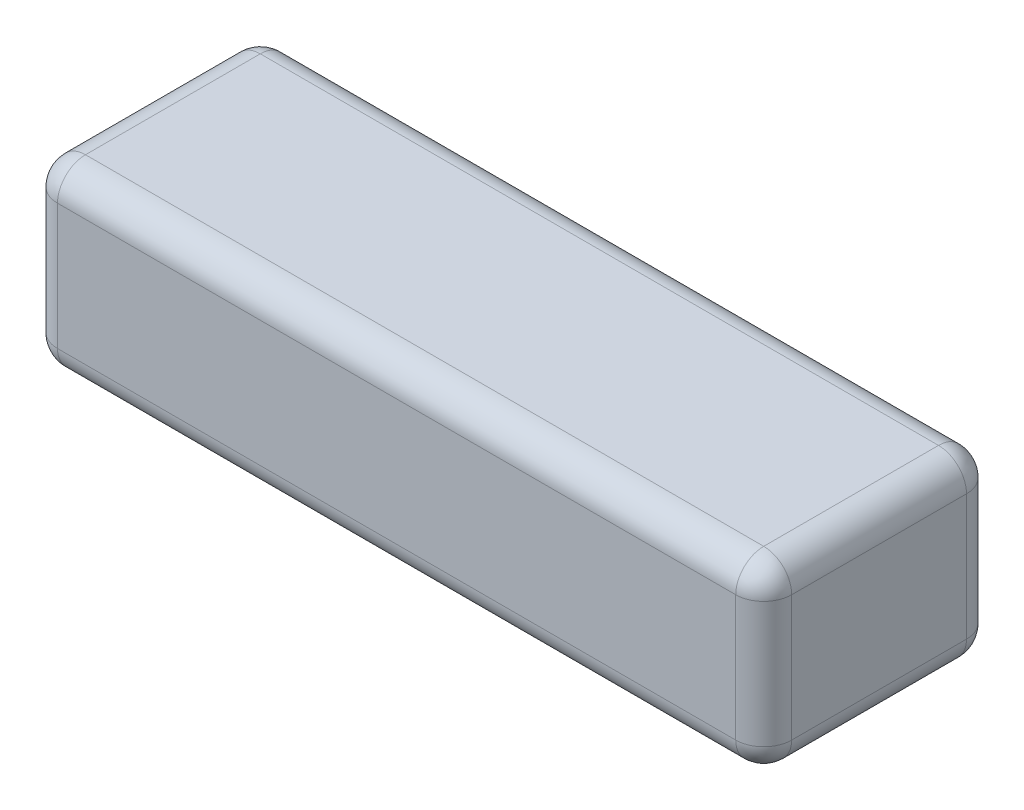
ISO-10303-21;
HEADER;
FILE_DESCRIPTION(('STEP AP214'),'2;1');
FILE_NAME('part.step','',(''),(''),'','','');
FILE_SCHEMA(('AUTOMOTIVE_DESIGN { 1 0 10303 214 1 1 1 1 }'));
ENDSEC;
DATA;
#1=APPLICATION_CONTEXT('core data for automotive mechanical design processes');
#2=APPLICATION_PROTOCOL_DEFINITION('international standard','automotive_design',2000,#1);
#3=PRODUCT_CONTEXT('',#1,'mechanical');
#4=PRODUCT('Part','Part','',(#3));
#5=PRODUCT_RELATED_PRODUCT_CATEGORY('part','',(#4));
#6=PRODUCT_DEFINITION_FORMATION('','',#4);
#7=PRODUCT_DEFINITION_CONTEXT('part definition',#1,'design');
#8=PRODUCT_DEFINITION('design','',#6,#7);
#9=PRODUCT_DEFINITION_SHAPE('','',#8);
#10=(LENGTH_UNIT() NAMED_UNIT(*) SI_UNIT(.MILLI.,.METRE.));
#11=(NAMED_UNIT(*) PLANE_ANGLE_UNIT() SI_UNIT($,.RADIAN.));
#12=(NAMED_UNIT(*) SI_UNIT($,.STERADIAN.) SOLID_ANGLE_UNIT());
#13=UNCERTAINTY_MEASURE_WITH_UNIT(LENGTH_MEASURE(1.E-05),#10,'distance_accuracy_value','');
#14=(GEOMETRIC_REPRESENTATION_CONTEXT(3) GLOBAL_UNCERTAINTY_ASSIGNED_CONTEXT((#13)) GLOBAL_UNIT_ASSIGNED_CONTEXT((#10,
#11,#12)) REPRESENTATION_CONTEXT('',''));
#15=CARTESIAN_POINT('',(0.,0.,0.));
#16=DIRECTION('',(0.,0.,1.));
#17=DIRECTION('',(1.,0.,0.));
#18=AXIS2_PLACEMENT_3D('',#15,#16,#17);
#19=CARTESIAN_POINT('',(0.,26.,0.));
#20=DIRECTION('',(1.,0.,0.));
#21=DIRECTION('',(0.,0.,-1.));
#22=AXIS2_PLACEMENT_3D('',#19,#20,#21);
#23=PLANE('',#22);
#24=DIRECTION('',(0.,0.,1.));
#25=VECTOR('',#24,1.);
#26=CARTESIAN_POINT('',(0.,4.,0.));
#27=LINE('',#26,#25);
#28=CARTESIAN_POINT('',(0.,4.,-29.));
#29=VERTEX_POINT('',#28);
#30=CARTESIAN_POINT('',(0.,4.,-4.));
#31=VERTEX_POINT('',#30);
#32=EDGE_CURVE('E166',#29,#31,#27,.T.);
#33=ORIENTED_EDGE('',*,*,#32,.T.);
#34=DIRECTION('',(0.,-1.,0.));
#35=VECTOR('',#34,1.);
#36=CARTESIAN_POINT('',(0.,26.,-4.));
#37=LINE('',#36,#35);
#38=CARTESIAN_POINT('',(0.,22.,-4.));
#39=VERTEX_POINT('',#38);
#40=EDGE_CURVE('E168',#31,#39,#37,.F.);
#41=ORIENTED_EDGE('',*,*,#40,.T.);
#42=DIRECTION('',(0.,0.,1.));
#43=VECTOR('',#42,1.);
#44=CARTESIAN_POINT('',(0.,22.,0.));
#45=LINE('',#44,#43);
#46=CARTESIAN_POINT('',(0.,22.,-29.));
#47=VERTEX_POINT('',#46);
#48=EDGE_CURVE('E164',#39,#47,#45,.F.);
#49=ORIENTED_EDGE('',*,*,#48,.T.);
#50=DIRECTION('',(0.,-1.,0.));
#51=VECTOR('',#50,1.);
#52=CARTESIAN_POINT('',(0.,26.,-29.));
#53=LINE('',#52,#51);
#54=EDGE_CURVE('E162',#47,#29,#53,.T.);
#55=ORIENTED_EDGE('',*,*,#54,.T.);
#56=EDGE_LOOP('',(#33,#41,#49,#55));
#57=FACE_BOUND('',#56,.T.);
#58=ADVANCED_FACE('F34',(#57),#23,.F.);
#59=CARTESIAN_POINT('',(0.,26.,0.));
#60=DIRECTION('',(0.,0.,-1.));
#61=DIRECTION('',(-1.,0.,0.));
#62=AXIS2_PLACEMENT_3D('',#59,#60,#61);
#63=PLANE('',#62);
#64=DIRECTION('',(0.,-1.,0.));
#65=VECTOR('',#64,1.);
#66=CARTESIAN_POINT('',(4.,26.,0.));
#67=LINE('',#66,#65);
#68=CARTESIAN_POINT('',(4.,22.,0.));
#69=VERTEX_POINT('',#68);
#70=CARTESIAN_POINT('',(4.,4.,0.));
#71=VERTEX_POINT('',#70);
#72=EDGE_CURVE('E133',#69,#71,#67,.T.);
#73=ORIENTED_EDGE('',*,*,#72,.T.);
#74=DIRECTION('',(1.,0.,0.));
#75=VECTOR('',#74,1.);
#76=CARTESIAN_POINT('',(105.,4.,0.));
#77=LINE('',#76,#75);
#78=CARTESIAN_POINT('',(101.,4.,0.));
#79=VERTEX_POINT('',#78);
#80=EDGE_CURVE('E129',#71,#79,#77,.T.);
#81=ORIENTED_EDGE('',*,*,#80,.T.);
#82=DIRECTION('',(0.,-1.,0.));
#83=VECTOR('',#82,1.);
#84=CARTESIAN_POINT('',(101.,26.,0.));
#85=LINE('',#84,#83);
#86=CARTESIAN_POINT('',(101.,22.,0.));
#87=VERTEX_POINT('',#86);
#88=EDGE_CURVE('E121',#79,#87,#85,.F.);
#89=ORIENTED_EDGE('',*,*,#88,.T.);
#90=DIRECTION('',(1.,0.,0.));
#91=VECTOR('',#90,1.);
#92=CARTESIAN_POINT('',(0.,22.,0.));
#93=LINE('',#92,#91);
#94=EDGE_CURVE('E126',#87,#69,#93,.F.);
#95=ORIENTED_EDGE('',*,*,#94,.T.);
#96=EDGE_LOOP('',(#73,#81,#89,#95));
#97=FACE_BOUND('',#96,.T.);
#98=ADVANCED_FACE('F124',(#97),#63,.F.);
#99=CARTESIAN_POINT('',(105.,26.,0.));
#100=DIRECTION('',(-1.,0.,0.));
#101=DIRECTION('',(0.,0.,1.));
#102=AXIS2_PLACEMENT_3D('',#99,#100,#101);
#103=PLANE('',#102);
#104=DIRECTION('',(0.,-1.,0.));
#105=VECTOR('',#104,1.);
#106=CARTESIAN_POINT('',(105.,26.,-4.));
#107=LINE('',#106,#105);
#108=CARTESIAN_POINT('',(105.,22.,-4.));
#109=VERTEX_POINT('',#108);
#110=CARTESIAN_POINT('',(105.,4.,-4.));
#111=VERTEX_POINT('',#110);
#112=EDGE_CURVE('E54',#109,#111,#107,.T.);
#113=ORIENTED_EDGE('',*,*,#112,.T.);
#114=DIRECTION('',(0.,0.,-1.));
#115=VECTOR('',#114,1.);
#116=CARTESIAN_POINT('',(105.,4.,-33.));
#117=LINE('',#116,#115);
#118=CARTESIAN_POINT('',(105.,4.,-29.));
#119=VERTEX_POINT('',#118);
#120=EDGE_CURVE('E11',#111,#119,#117,.T.);
#121=ORIENTED_EDGE('',*,*,#120,.T.);
#122=DIRECTION('',(0.,-1.,0.));
#123=VECTOR('',#122,1.);
#124=CARTESIAN_POINT('',(105.,26.,-29.));
#125=LINE('',#124,#123);
#126=CARTESIAN_POINT('',(105.,22.,-29.));
#127=VERTEX_POINT('',#126);
#128=EDGE_CURVE('E43',#119,#127,#125,.F.);
#129=ORIENTED_EDGE('',*,*,#128,.T.);
#130=DIRECTION('',(0.,0.,-1.));
#131=VECTOR('',#130,1.);
#132=CARTESIAN_POINT('',(105.,22.,0.));
#133=LINE('',#132,#131);
#134=EDGE_CURVE('E198',#127,#109,#133,.F.);
#135=ORIENTED_EDGE('',*,*,#134,.T.);
#136=EDGE_LOOP('',(#113,#121,#129,#135));
#137=FACE_BOUND('',#136,.T.);
#138=ADVANCED_FACE('F295',(#137),#103,.F.);
#139=CARTESIAN_POINT('',(0.,26.,-33.));
#140=DIRECTION('',(0.,0.,1.));
#141=DIRECTION('',(1.,0.,0.));
#142=AXIS2_PLACEMENT_3D('',#139,#140,#141);
#143=PLANE('',#142);
#144=DIRECTION('',(0.,-1.,0.));
#145=VECTOR('',#144,1.);
#146=CARTESIAN_POINT('',(101.,26.,-33.));
#147=LINE('',#146,#145);
#148=CARTESIAN_POINT('',(101.,22.,-33.));
#149=VERTEX_POINT('',#148);
#150=CARTESIAN_POINT('',(101.,4.,-33.));
#151=VERTEX_POINT('',#150);
#152=EDGE_CURVE('E191',#149,#151,#147,.T.);
#153=ORIENTED_EDGE('',*,*,#152,.T.);
#154=DIRECTION('',(-1.,0.,0.));
#155=VECTOR('',#154,1.);
#156=CARTESIAN_POINT('',(0.,4.,-33.));
#157=LINE('',#156,#155);
#158=CARTESIAN_POINT('',(4.,4.,-33.));
#159=VERTEX_POINT('',#158);
#160=EDGE_CURVE('E196',#151,#159,#157,.T.);
#161=ORIENTED_EDGE('',*,*,#160,.T.);
#162=DIRECTION('',(0.,-1.,0.));
#163=VECTOR('',#162,1.);
#164=CARTESIAN_POINT('',(4.,26.,-33.));
#165=LINE('',#164,#163);
#166=CARTESIAN_POINT('',(4.,22.,-33.));
#167=VERTEX_POINT('',#166);
#168=EDGE_CURVE('E193',#159,#167,#165,.F.);
#169=ORIENTED_EDGE('',*,*,#168,.T.);
#170=DIRECTION('',(-1.,0.,0.));
#171=VECTOR('',#170,1.);
#172=CARTESIAN_POINT('',(0.,22.,-33.));
#173=LINE('',#172,#171);
#174=EDGE_CURVE('E189',#167,#149,#173,.F.);
#175=ORIENTED_EDGE('',*,*,#174,.T.);
#176=EDGE_LOOP('',(#153,#161,#169,#175));
#177=FACE_BOUND('',#176,.T.);
#178=ADVANCED_FACE('F273',(#177),#143,.F.);
#179=CARTESIAN_POINT('',(0.,26.,0.));
#180=DIRECTION('',(0.,-1.,0.));
#181=DIRECTION('',(0.,0.,-1.));
#182=AXIS2_PLACEMENT_3D('',#179,#180,#181);
#183=PLANE('',#182);
#184=DIRECTION('',(0.,0.,-1.));
#185=VECTOR('',#184,1.);
#186=CARTESIAN_POINT('',(101.,26.,0.));
#187=LINE('',#186,#185);
#188=CARTESIAN_POINT('',(101.,26.,-4.));
#189=VERTEX_POINT('',#188);
#190=CARTESIAN_POINT('',(101.,26.,-29.));
#191=VERTEX_POINT('',#190);
#192=EDGE_CURVE('E182',#189,#191,#187,.T.);
#193=ORIENTED_EDGE('',*,*,#192,.T.);
#194=DIRECTION('',(-1.,0.,0.));
#195=VECTOR('',#194,1.);
#196=CARTESIAN_POINT('',(0.,26.,-29.));
#197=LINE('',#196,#195);
#198=CARTESIAN_POINT('',(4.,26.,-29.));
#199=VERTEX_POINT('',#198);
#200=EDGE_CURVE('E187',#191,#199,#197,.T.);
#201=ORIENTED_EDGE('',*,*,#200,.T.);
#202=DIRECTION('',(0.,0.,1.));
#203=VECTOR('',#202,1.);
#204=CARTESIAN_POINT('',(4.,26.,0.));
#205=LINE('',#204,#203);
#206=CARTESIAN_POINT('',(4.,26.,-4.));
#207=VERTEX_POINT('',#206);
#208=EDGE_CURVE('E184',#199,#207,#205,.T.);
#209=ORIENTED_EDGE('',*,*,#208,.T.);
#210=DIRECTION('',(1.,0.,0.));
#211=VECTOR('',#210,1.);
#212=CARTESIAN_POINT('',(0.,26.,-4.));
#213=LINE('',#212,#211);
#214=EDGE_CURVE('E180',#207,#189,#213,.T.);
#215=ORIENTED_EDGE('',*,*,#214,.T.);
#216=EDGE_LOOP('',(#193,#201,#209,#215));
#217=FACE_BOUND('',#216,.T.);
#218=ADVANCED_FACE('F302',(#217),#183,.F.);
#219=CARTESIAN_POINT('',(0.,0.,0.));
#220=DIRECTION('',(0.,-1.,0.));
#221=DIRECTION('',(0.,0.,-1.));
#222=AXIS2_PLACEMENT_3D('',#219,#220,#221);
#223=PLANE('',#222);
#224=DIRECTION('',(0.,0.,1.));
#225=VECTOR('',#224,1.);
#226=CARTESIAN_POINT('',(4.,0.,-33.));
#227=LINE('',#226,#225);
#228=CARTESIAN_POINT('',(4.,0.,-4.));
#229=VERTEX_POINT('',#228);
#230=CARTESIAN_POINT('',(4.,0.,-29.));
#231=VERTEX_POINT('',#230);
#232=EDGE_CURVE('E175',#229,#231,#227,.F.);
#233=ORIENTED_EDGE('',*,*,#232,.T.);
#234=DIRECTION('',(-1.,0.,0.));
#235=VECTOR('',#234,1.);
#236=CARTESIAN_POINT('',(105.,0.,-29.));
#237=LINE('',#236,#235);
#238=CARTESIAN_POINT('',(101.,0.,-29.));
#239=VERTEX_POINT('',#238);
#240=EDGE_CURVE('E178',#231,#239,#237,.F.);
#241=ORIENTED_EDGE('',*,*,#240,.T.);
#242=DIRECTION('',(0.,0.,-1.));
#243=VECTOR('',#242,1.);
#244=CARTESIAN_POINT('',(101.,0.,0.));
#245=LINE('',#244,#243);
#246=CARTESIAN_POINT('',(101.,0.,-4.));
#247=VERTEX_POINT('',#246);
#248=EDGE_CURVE('E173',#239,#247,#245,.F.);
#249=ORIENTED_EDGE('',*,*,#248,.T.);
#250=DIRECTION('',(1.,0.,0.));
#251=VECTOR('',#250,1.);
#252=CARTESIAN_POINT('',(0.,0.,-4.));
#253=LINE('',#252,#251);
#254=EDGE_CURVE('E171',#247,#229,#253,.F.);
#255=ORIENTED_EDGE('',*,*,#254,.T.);
#256=EDGE_LOOP('',(#233,#241,#249,#255));
#257=FACE_BOUND('',#256,.T.);
#258=ADVANCED_FACE('F264',(#257),#223,.T.);
#259=CARTESIAN_POINT('',(101.,26.,-29.));
#260=DIRECTION('',(0.,-1.,0.));
#261=DIRECTION('',(0.,0.,-1.));
#262=AXIS2_PLACEMENT_3D('',#259,#260,#261);
#263=CYLINDRICAL_SURFACE('',#262,4.);
#264=CARTESIAN_POINT('',(101.,22.,-29.));
#265=DIRECTION('',(0.,1.,0.));
#266=DIRECTION('',(0.,0.,1.));
#267=AXIS2_PLACEMENT_3D('',#264,#265,#266);
#268=CIRCLE('',#267,4.);
#269=EDGE_CURVE('E38',#127,#149,#268,.T.);
#270=ORIENTED_EDGE('',*,*,#269,.F.);
#271=ORIENTED_EDGE('',*,*,#128,.F.);
#272=CARTESIAN_POINT('',(101.,4.,-29.));
#273=DIRECTION('',(0.,-1.,0.));
#274=DIRECTION('',(0.,0.,-1.));
#275=AXIS2_PLACEMENT_3D('',#272,#273,#274);
#276=CIRCLE('',#275,4.);
#277=EDGE_CURVE('E158',#151,#119,#276,.T.);
#278=ORIENTED_EDGE('',*,*,#277,.F.);
#279=ORIENTED_EDGE('',*,*,#152,.F.);
#280=EDGE_LOOP('',(#270,#271,#278,#279));
#281=FACE_BOUND('',#280,.T.);
#282=ADVANCED_FACE('F36',(#281),#263,.T.);
#283=CARTESIAN_POINT('',(101.,22.,-29.));
#284=DIRECTION('',(0.,0.,1.));
#285=DIRECTION('',(1.,0.,0.));
#286=AXIS2_PLACEMENT_3D('',#283,#284,#285);
#287=SPHERICAL_SURFACE('',#286,4.);
#288=CARTESIAN_POINT('',(101.,22.,-29.));
#289=DIRECTION('',(0.,0.,-1.));
#290=DIRECTION('',(-1.,0.,0.));
#291=AXIS2_PLACEMENT_3D('',#288,#289,#290);
#292=CIRCLE('',#291,4.);
#293=EDGE_CURVE('E244',#127,#191,#292,.F.);
#294=ORIENTED_EDGE('',*,*,#293,.F.);
#295=ORIENTED_EDGE('',*,*,#269,.T.);
#296=CARTESIAN_POINT('',(101.,22.,-29.));
#297=DIRECTION('',(1.,0.,0.));
#298=DIRECTION('',(0.,0.,-1.));
#299=AXIS2_PLACEMENT_3D('',#296,#297,#298);
#300=CIRCLE('',#299,4.);
#301=EDGE_CURVE('E247',#191,#149,#300,.F.);
#302=ORIENTED_EDGE('',*,*,#301,.F.);
#303=EDGE_LOOP('',(#294,#295,#302));
#304=FACE_BOUND('',#303,.T.);
#305=ADVANCED_FACE('F291',(#304),#287,.T.);
#306=CARTESIAN_POINT('',(101.,4.,-29.));
#307=DIRECTION('',(0.,0.,1.));
#308=DIRECTION('',(1.,0.,0.));
#309=AXIS2_PLACEMENT_3D('',#306,#307,#308);
#310=SPHERICAL_SURFACE('',#309,4.);
#311=CARTESIAN_POINT('',(101.,4.,-29.));
#312=DIRECTION('',(1.,0.,0.));
#313=DIRECTION('',(0.,0.,-1.));
#314=AXIS2_PLACEMENT_3D('',#311,#312,#313);
#315=CIRCLE('',#314,4.);
#316=EDGE_CURVE('E238',#151,#239,#315,.F.);
#317=ORIENTED_EDGE('',*,*,#316,.F.);
#318=ORIENTED_EDGE('',*,*,#277,.T.);
#319=CARTESIAN_POINT('',(101.,4.,-29.));
#320=DIRECTION('',(0.,0.,-1.));
#321=DIRECTION('',(-1.,0.,0.));
#322=AXIS2_PLACEMENT_3D('',#319,#320,#321);
#323=CIRCLE('',#322,4.);
#324=EDGE_CURVE('E241',#239,#119,#323,.F.);
#325=ORIENTED_EDGE('',*,*,#324,.F.);
#326=EDGE_LOOP('',(#317,#318,#325));
#327=FACE_BOUND('',#326,.T.);
#328=ADVANCED_FACE('F254',(#327),#310,.T.);
#329=CARTESIAN_POINT('',(0.,22.,-29.));
#330=DIRECTION('',(-1.,0.,0.));
#331=DIRECTION('',(0.,0.,1.));
#332=AXIS2_PLACEMENT_3D('',#329,#330,#331);
#333=CYLINDRICAL_SURFACE('',#332,4.);
#334=ORIENTED_EDGE('',*,*,#301,.T.);
#335=ORIENTED_EDGE('',*,*,#174,.F.);
#336=CARTESIAN_POINT('',(4.,22.,-29.));
#337=DIRECTION('',(-1.,0.,0.));
#338=DIRECTION('',(0.,0.,1.));
#339=AXIS2_PLACEMENT_3D('',#336,#337,#338);
#340=CIRCLE('',#339,4.);
#341=EDGE_CURVE('E233',#199,#167,#340,.T.);
#342=ORIENTED_EDGE('',*,*,#341,.F.);
#343=ORIENTED_EDGE('',*,*,#200,.F.);
#344=EDGE_LOOP('',(#334,#335,#342,#343));
#345=FACE_BOUND('',#344,.T.);
#346=ADVANCED_FACE('F285',(#345),#333,.T.);
#347=CARTESIAN_POINT('',(101.,22.,0.));
#348=DIRECTION('',(0.,0.,-1.));
#349=DIRECTION('',(-1.,0.,0.));
#350=AXIS2_PLACEMENT_3D('',#347,#348,#349);
#351=CYLINDRICAL_SURFACE('',#350,4.);
#352=ORIENTED_EDGE('',*,*,#293,.T.);
#353=ORIENTED_EDGE('',*,*,#192,.F.);
#354=CARTESIAN_POINT('',(101.,22.,-4.));
#355=DIRECTION('',(0.,0.,1.));
#356=DIRECTION('',(0.,-1.,0.));
#357=AXIS2_PLACEMENT_3D('',#354,#355,#356);
#358=CIRCLE('',#357,4.);
#359=EDGE_CURVE('E142',#109,#189,#358,.T.);
#360=ORIENTED_EDGE('',*,*,#359,.F.);
#361=ORIENTED_EDGE('',*,*,#134,.F.);
#362=EDGE_LOOP('',(#352,#353,#360,#361));
#363=FACE_BOUND('',#362,.T.);
#364=ADVANCED_FACE('F294',(#363),#351,.T.);
#365=CARTESIAN_POINT('',(101.,26.,-4.));
#366=DIRECTION('',(0.,-1.,0.));
#367=DIRECTION('',(0.,0.,-1.));
#368=AXIS2_PLACEMENT_3D('',#365,#366,#367);
#369=CYLINDRICAL_SURFACE('',#368,4.);
#370=CARTESIAN_POINT('',(101.,4.,-4.));
#371=DIRECTION('',(0.,-1.,0.));
#372=DIRECTION('',(0.,0.,-1.));
#373=AXIS2_PLACEMENT_3D('',#370,#371,#372);
#374=CIRCLE('',#373,4.);
#375=EDGE_CURVE('E143',#111,#79,#374,.T.);
#376=ORIENTED_EDGE('',*,*,#375,.F.);
#377=ORIENTED_EDGE('',*,*,#112,.F.);
#378=CARTESIAN_POINT('',(101.,22.,-4.));
#379=DIRECTION('',(0.,1.,0.));
#380=DIRECTION('',(0.,0.,1.));
#381=AXIS2_PLACEMENT_3D('',#378,#379,#380);
#382=CIRCLE('',#381,4.);
#383=EDGE_CURVE('E136',#87,#109,#382,.T.);
#384=ORIENTED_EDGE('',*,*,#383,.F.);
#385=ORIENTED_EDGE('',*,*,#88,.F.);
#386=EDGE_LOOP('',(#376,#377,#384,#385));
#387=FACE_BOUND('',#386,.T.);
#388=ADVANCED_FACE('F138',(#387),#369,.T.);
#389=CARTESIAN_POINT('',(101.,4.,0.));
#390=DIRECTION('',(0.,0.,1.));
#391=DIRECTION('',(1.,0.,0.));
#392=AXIS2_PLACEMENT_3D('',#389,#390,#391);
#393=CYLINDRICAL_SURFACE('',#392,4.);
#394=ORIENTED_EDGE('',*,*,#324,.T.);
#395=ORIENTED_EDGE('',*,*,#120,.F.);
#396=CARTESIAN_POINT('',(101.,4.,-4.));
#397=DIRECTION('',(0.,0.,1.));
#398=DIRECTION('',(1.,0.,0.));
#399=AXIS2_PLACEMENT_3D('',#396,#397,#398);
#400=CIRCLE('',#399,4.);
#401=EDGE_CURVE('E228',#247,#111,#400,.T.);
#402=ORIENTED_EDGE('',*,*,#401,.F.);
#403=ORIENTED_EDGE('',*,*,#248,.F.);
#404=EDGE_LOOP('',(#394,#395,#402,#403));
#405=FACE_BOUND('',#404,.T.);
#406=ADVANCED_FACE('F260',(#405),#393,.T.);
#407=CARTESIAN_POINT('',(0.,4.,-29.));
#408=DIRECTION('',(1.,0.,0.));
#409=DIRECTION('',(0.,0.,-1.));
#410=AXIS2_PLACEMENT_3D('',#407,#408,#409);
#411=CYLINDRICAL_SURFACE('',#410,4.);
#412=ORIENTED_EDGE('',*,*,#316,.T.);
#413=ORIENTED_EDGE('',*,*,#240,.F.);
#414=CARTESIAN_POINT('',(4.,4.,-29.));
#415=DIRECTION('',(-1.,0.,0.));
#416=DIRECTION('',(0.,0.,1.));
#417=AXIS2_PLACEMENT_3D('',#414,#415,#416);
#418=CIRCLE('',#417,4.);
#419=EDGE_CURVE('E225',#159,#231,#418,.T.);
#420=ORIENTED_EDGE('',*,*,#419,.F.);
#421=ORIENTED_EDGE('',*,*,#160,.F.);
#422=EDGE_LOOP('',(#412,#413,#420,#421));
#423=FACE_BOUND('',#422,.T.);
#424=ADVANCED_FACE('F270',(#423),#411,.T.);
#425=CARTESIAN_POINT('',(4.,26.,-29.));
#426=DIRECTION('',(0.,-1.,0.));
#427=DIRECTION('',(0.,0.,-1.));
#428=AXIS2_PLACEMENT_3D('',#425,#426,#427);
#429=CYLINDRICAL_SURFACE('',#428,4.);
#430=CARTESIAN_POINT('',(4.,22.,-29.));
#431=DIRECTION('',(0.,1.,0.));
#432=DIRECTION('',(0.,0.,1.));
#433=AXIS2_PLACEMENT_3D('',#430,#431,#432);
#434=CIRCLE('',#433,4.);
#435=EDGE_CURVE('E235',#167,#47,#434,.T.);
#436=ORIENTED_EDGE('',*,*,#435,.F.);
#437=ORIENTED_EDGE('',*,*,#168,.F.);
#438=CARTESIAN_POINT('',(4.,4.,-29.));
#439=DIRECTION('',(0.,-1.,0.));
#440=DIRECTION('',(0.,0.,-1.));
#441=AXIS2_PLACEMENT_3D('',#438,#439,#440);
#442=CIRCLE('',#441,4.);
#443=EDGE_CURVE('E222',#29,#159,#442,.T.);
#444=ORIENTED_EDGE('',*,*,#443,.F.);
#445=ORIENTED_EDGE('',*,*,#54,.F.);
#446=EDGE_LOOP('',(#436,#437,#444,#445));
#447=FACE_BOUND('',#446,.T.);
#448=ADVANCED_FACE('F277',(#447),#429,.T.);
#449=CARTESIAN_POINT('',(4.,22.,-29.));
#450=DIRECTION('',(0.,0.,1.));
#451=DIRECTION('',(1.,0.,0.));
#452=AXIS2_PLACEMENT_3D('',#449,#450,#451);
#453=SPHERICAL_SURFACE('',#452,4.);
#454=ORIENTED_EDGE('',*,*,#341,.T.);
#455=ORIENTED_EDGE('',*,*,#435,.T.);
#456=CARTESIAN_POINT('',(4.,22.,-29.));
#457=DIRECTION('',(0.,0.,-1.));
#458=DIRECTION('',(-1.,0.,0.));
#459=AXIS2_PLACEMENT_3D('',#456,#457,#458);
#460=CIRCLE('',#459,4.);
#461=EDGE_CURVE('E150',#199,#47,#460,.F.);
#462=ORIENTED_EDGE('',*,*,#461,.F.);
#463=EDGE_LOOP('',(#454,#455,#462));
#464=FACE_BOUND('',#463,.T.);
#465=ADVANCED_FACE('F347',(#464),#453,.T.);
#466=CARTESIAN_POINT('',(101.,22.,-4.));
#467=DIRECTION('',(0.,0.,1.));
#468=DIRECTION('',(1.,0.,0.));
#469=AXIS2_PLACEMENT_3D('',#466,#467,#468);
#470=SPHERICAL_SURFACE('',#469,4.);
#471=ORIENTED_EDGE('',*,*,#383,.T.);
#472=ORIENTED_EDGE('',*,*,#359,.T.);
#473=CARTESIAN_POINT('',(101.,22.,-4.));
#474=DIRECTION('',(1.,0.,0.));
#475=DIRECTION('',(0.,0.,-1.));
#476=AXIS2_PLACEMENT_3D('',#473,#474,#475);
#477=CIRCLE('',#476,4.);
#478=EDGE_CURVE('E146',#87,#189,#477,.F.);
#479=ORIENTED_EDGE('',*,*,#478,.F.);
#480=EDGE_LOOP('',(#471,#472,#479));
#481=FACE_BOUND('',#480,.T.);
#482=ADVANCED_FACE('F147',(#481),#470,.T.);
#483=CARTESIAN_POINT('',(101.,4.,-4.));
#484=DIRECTION('',(0.,0.,1.));
#485=DIRECTION('',(1.,0.,0.));
#486=AXIS2_PLACEMENT_3D('',#483,#484,#485);
#487=SPHERICAL_SURFACE('',#486,4.);
#488=ORIENTED_EDGE('',*,*,#401,.T.);
#489=ORIENTED_EDGE('',*,*,#375,.T.);
#490=CARTESIAN_POINT('',(101.,4.,-4.));
#491=DIRECTION('',(1.,0.,0.));
#492=DIRECTION('',(0.,0.,-1.));
#493=AXIS2_PLACEMENT_3D('',#490,#491,#492);
#494=CIRCLE('',#493,4.);
#495=EDGE_CURVE('E151',#247,#79,#494,.F.);
#496=ORIENTED_EDGE('',*,*,#495,.F.);
#497=EDGE_LOOP('',(#488,#489,#496));
#498=FACE_BOUND('',#497,.T.);
#499=ADVANCED_FACE('F340',(#498),#487,.T.);
#500=CARTESIAN_POINT('',(4.,4.,-29.));
#501=DIRECTION('',(0.,0.,1.));
#502=DIRECTION('',(1.,0.,0.));
#503=AXIS2_PLACEMENT_3D('',#500,#501,#502);
#504=SPHERICAL_SURFACE('',#503,4.);
#505=ORIENTED_EDGE('',*,*,#443,.T.);
#506=ORIENTED_EDGE('',*,*,#419,.T.);
#507=CARTESIAN_POINT('',(4.,4.,-29.));
#508=DIRECTION('',(0.,0.,-1.));
#509=DIRECTION('',(-1.,0.,0.));
#510=AXIS2_PLACEMENT_3D('',#507,#508,#509);
#511=CIRCLE('',#510,4.);
#512=EDGE_CURVE('E216',#29,#231,#511,.F.);
#513=ORIENTED_EDGE('',*,*,#512,.F.);
#514=EDGE_LOOP('',(#505,#506,#513));
#515=FACE_BOUND('',#514,.T.);
#516=ADVANCED_FACE('F336',(#515),#504,.T.);
#517=CARTESIAN_POINT('',(4.,22.,0.));
#518=DIRECTION('',(0.,0.,1.));
#519=DIRECTION('',(1.,0.,0.));
#520=AXIS2_PLACEMENT_3D('',#517,#518,#519);
#521=CYLINDRICAL_SURFACE('',#520,4.);
#522=ORIENTED_EDGE('',*,*,#461,.T.);
#523=ORIENTED_EDGE('',*,*,#48,.F.);
#524=CARTESIAN_POINT('',(4.,22.,-4.));
#525=DIRECTION('',(0.,0.,1.));
#526=DIRECTION('',(1.,0.,0.));
#527=AXIS2_PLACEMENT_3D('',#524,#525,#526);
#528=CIRCLE('',#527,4.);
#529=EDGE_CURVE('E213',#207,#39,#528,.T.);
#530=ORIENTED_EDGE('',*,*,#529,.F.);
#531=ORIENTED_EDGE('',*,*,#208,.F.);
#532=EDGE_LOOP('',(#522,#523,#530,#531));
#533=FACE_BOUND('',#532,.T.);
#534=ADVANCED_FACE('F333',(#533),#521,.T.);
#535=CARTESIAN_POINT('',(0.,22.,-4.));
#536=DIRECTION('',(1.,0.,0.));
#537=DIRECTION('',(0.,0.,-1.));
#538=AXIS2_PLACEMENT_3D('',#535,#536,#537);
#539=CYLINDRICAL_SURFACE('',#538,4.);
#540=ORIENTED_EDGE('',*,*,#478,.T.);
#541=ORIENTED_EDGE('',*,*,#214,.F.);
#542=CARTESIAN_POINT('',(4.,22.,-4.));
#543=DIRECTION('',(-1.,0.,0.));
#544=DIRECTION('',(0.,-1.,0.));
#545=AXIS2_PLACEMENT_3D('',#542,#543,#544);
#546=CIRCLE('',#545,4.);
#547=EDGE_CURVE('E154',#69,#207,#546,.T.);
#548=ORIENTED_EDGE('',*,*,#547,.F.);
#549=ORIENTED_EDGE('',*,*,#94,.F.);
#550=EDGE_LOOP('',(#540,#541,#548,#549));
#551=FACE_BOUND('',#550,.T.);
#552=ADVANCED_FACE('F153',(#551),#539,.T.);
#553=CARTESIAN_POINT('',(0.,4.,-4.));
#554=DIRECTION('',(-1.,0.,0.));
#555=DIRECTION('',(0.,0.,1.));
#556=AXIS2_PLACEMENT_3D('',#553,#554,#555);
#557=CYLINDRICAL_SURFACE('',#556,4.);
#558=ORIENTED_EDGE('',*,*,#495,.T.);
#559=ORIENTED_EDGE('',*,*,#80,.F.);
#560=CARTESIAN_POINT('',(4.,4.,-4.));
#561=DIRECTION('',(-1.,0.,0.));
#562=DIRECTION('',(0.,0.,1.));
#563=AXIS2_PLACEMENT_3D('',#560,#561,#562);
#564=CIRCLE('',#563,4.);
#565=EDGE_CURVE('E209',#229,#71,#564,.T.);
#566=ORIENTED_EDGE('',*,*,#565,.F.);
#567=ORIENTED_EDGE('',*,*,#254,.F.);
#568=EDGE_LOOP('',(#558,#559,#566,#567));
#569=FACE_BOUND('',#568,.T.);
#570=ADVANCED_FACE('F326',(#569),#557,.T.);
#571=CARTESIAN_POINT('',(4.,4.,0.));
#572=DIRECTION('',(0.,0.,-1.));
#573=DIRECTION('',(-1.,0.,0.));
#574=AXIS2_PLACEMENT_3D('',#571,#572,#573);
#575=CYLINDRICAL_SURFACE('',#574,4.);
#576=ORIENTED_EDGE('',*,*,#512,.T.);
#577=ORIENTED_EDGE('',*,*,#232,.F.);
#578=CARTESIAN_POINT('',(4.,4.,-4.));
#579=DIRECTION('',(0.,0.,1.));
#580=DIRECTION('',(1.,0.,0.));
#581=AXIS2_PLACEMENT_3D('',#578,#579,#580);
#582=CIRCLE('',#581,4.);
#583=EDGE_CURVE('E206',#31,#229,#582,.T.);
#584=ORIENTED_EDGE('',*,*,#583,.F.);
#585=ORIENTED_EDGE('',*,*,#32,.F.);
#586=EDGE_LOOP('',(#576,#577,#584,#585));
#587=FACE_BOUND('',#586,.T.);
#588=ADVANCED_FACE('F322',(#587),#575,.T.);
#589=CARTESIAN_POINT('',(4.,22.,-4.));
#590=DIRECTION('',(0.,0.,1.));
#591=DIRECTION('',(1.,0.,0.));
#592=AXIS2_PLACEMENT_3D('',#589,#590,#591);
#593=SPHERICAL_SURFACE('',#592,4.);
#594=ORIENTED_EDGE('',*,*,#547,.T.);
#595=ORIENTED_EDGE('',*,*,#529,.T.);
#596=CARTESIAN_POINT('',(4.,22.,-4.));
#597=DIRECTION('',(0.,1.,0.));
#598=DIRECTION('',(0.,0.,1.));
#599=AXIS2_PLACEMENT_3D('',#596,#597,#598);
#600=CIRCLE('',#599,4.);
#601=EDGE_CURVE('E204',#69,#39,#600,.F.);
#602=ORIENTED_EDGE('',*,*,#601,.F.);
#603=EDGE_LOOP('',(#594,#595,#602));
#604=FACE_BOUND('',#603,.T.);
#605=ADVANCED_FACE('F318',(#604),#593,.T.);
#606=CARTESIAN_POINT('',(4.,4.,-4.));
#607=DIRECTION('',(0.,0.,1.));
#608=DIRECTION('',(1.,0.,0.));
#609=AXIS2_PLACEMENT_3D('',#606,#607,#608);
#610=SPHERICAL_SURFACE('',#609,4.);
#611=ORIENTED_EDGE('',*,*,#583,.T.);
#612=ORIENTED_EDGE('',*,*,#565,.T.);
#613=CARTESIAN_POINT('',(4.,4.,-4.));
#614=DIRECTION('',(0.,-1.,0.));
#615=DIRECTION('',(0.,0.,-1.));
#616=AXIS2_PLACEMENT_3D('',#613,#614,#615);
#617=CIRCLE('',#616,4.);
#618=EDGE_CURVE('E202',#31,#71,#617,.F.);
#619=ORIENTED_EDGE('',*,*,#618,.F.);
#620=EDGE_LOOP('',(#611,#612,#619));
#621=FACE_BOUND('',#620,.T.);
#622=ADVANCED_FACE('F314',(#621),#610,.T.);
#623=CARTESIAN_POINT('',(4.,26.,-4.));
#624=DIRECTION('',(0.,-1.,0.));
#625=DIRECTION('',(0.,0.,-1.));
#626=AXIS2_PLACEMENT_3D('',#623,#624,#625);
#627=CYLINDRICAL_SURFACE('',#626,4.);
#628=ORIENTED_EDGE('',*,*,#601,.T.);
#629=ORIENTED_EDGE('',*,*,#40,.F.);
#630=ORIENTED_EDGE('',*,*,#618,.T.);
#631=ORIENTED_EDGE('',*,*,#72,.F.);
#632=EDGE_LOOP('',(#628,#629,#630,#631));
#633=FACE_BOUND('',#632,.T.);
#634=ADVANCED_FACE('F311',(#633),#627,.T.);
#635=CLOSED_SHELL('',(#58,#98,#138,#178,#218,#258,#282,#305,#328,#346,#364,#388,#406,#424,#448,
#465,#482,#499,#516,#534,#552,#570,#588,#605,#622,#634));
#636=MANIFOLD_SOLID_BREP('B2',#635);
#637=ADVANCED_BREP_SHAPE_REPRESENTATION('',(#18,#636),#14);
#638=SHAPE_DEFINITION_REPRESENTATION(#9,#637);
ENDSEC;
END-ISO-10303-21;
